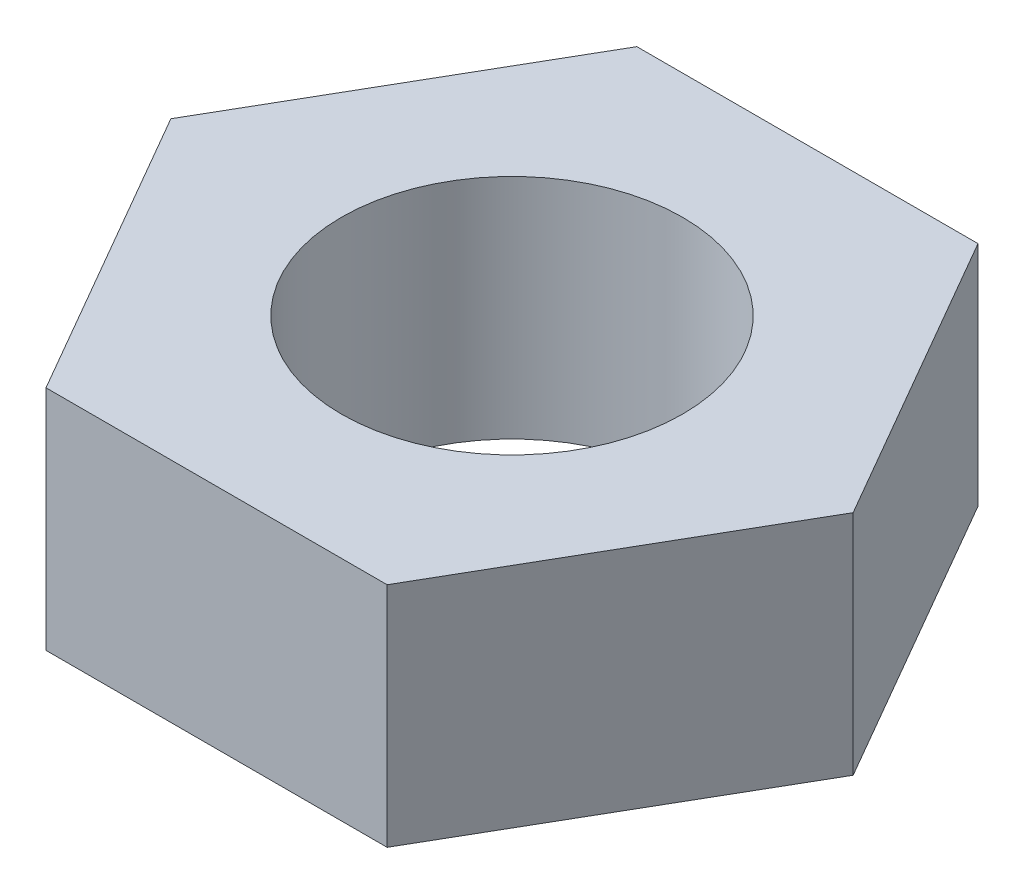
ISO-10303-21;
HEADER;
FILE_DESCRIPTION(('STEP AP214'),'2;1');
FILE_NAME('part.step','',(''),(''),'','','');
FILE_SCHEMA(('AUTOMOTIVE_DESIGN { 1 0 10303 214 1 1 1 1 }'));
ENDSEC;
DATA;
#1=APPLICATION_CONTEXT('core data for automotive mechanical design processes');
#2=APPLICATION_PROTOCOL_DEFINITION('international standard','automotive_design',2000,#1);
#3=PRODUCT_CONTEXT('',#1,'mechanical');
#4=PRODUCT('Part','Part','',(#3));
#5=PRODUCT_RELATED_PRODUCT_CATEGORY('part','',(#4));
#6=PRODUCT_DEFINITION_FORMATION('','',#4);
#7=PRODUCT_DEFINITION_CONTEXT('part definition',#1,'design');
#8=PRODUCT_DEFINITION('design','',#6,#7);
#9=PRODUCT_DEFINITION_SHAPE('','',#8);
#10=(LENGTH_UNIT() NAMED_UNIT(*) SI_UNIT(.MILLI.,.METRE.));
#11=(NAMED_UNIT(*) PLANE_ANGLE_UNIT() SI_UNIT($,.RADIAN.));
#12=(NAMED_UNIT(*) SI_UNIT($,.STERADIAN.) SOLID_ANGLE_UNIT());
#13=UNCERTAINTY_MEASURE_WITH_UNIT(LENGTH_MEASURE(1.E-05),#10,'distance_accuracy_value','');
#14=(GEOMETRIC_REPRESENTATION_CONTEXT(3) GLOBAL_UNCERTAINTY_ASSIGNED_CONTEXT((#13)) GLOBAL_UNIT_ASSIGNED_CONTEXT((#10,
#11,#12)) REPRESENTATION_CONTEXT('',''));
#15=CARTESIAN_POINT('',(0.,0.,0.));
#16=DIRECTION('',(0.,0.,1.));
#17=DIRECTION('',(1.,0.,0.));
#18=AXIS2_PLACEMENT_3D('',#15,#16,#17);
#19=CARTESIAN_POINT('',(0.,2.,0.));
#20=DIRECTION('',(0.,1.,0.));
#21=DIRECTION('',(0.,0.,1.));
#22=AXIS2_PLACEMENT_3D('',#19,#20,#21);
#23=PLANE('',#22);
#24=DIRECTION('',(0.5,0.,-0.866025403784439));
#25=VECTOR('',#24,1.);
#26=CARTESIAN_POINT('',(1.50000000000001,2.,2.59807621135334));
#27=LINE('',#26,#25);
#28=CARTESIAN_POINT('',(1.50000000000001,2.,2.59807621135334));
#29=VERTEX_POINT('',#28);
#30=CARTESIAN_POINT('',(3.00000000000002,2.,0.));
#31=VERTEX_POINT('',#30);
#32=EDGE_CURVE('E135',#29,#31,#27,.T.);
#33=ORIENTED_EDGE('',*,*,#32,.T.);
#34=DIRECTION('',(-0.5,0.,-0.866025403784439));
#35=VECTOR('',#34,1.);
#36=CARTESIAN_POINT('',(3.00000000000002,2.,0.));
#37=LINE('',#36,#35);
#38=CARTESIAN_POINT('',(1.50000000000001,2.,-2.59807621135334));
#39=VERTEX_POINT('',#38);
#40=EDGE_CURVE('E93',#31,#39,#37,.T.);
#41=ORIENTED_EDGE('',*,*,#40,.T.);
#42=DIRECTION('',(-1.,0.,0.));
#43=VECTOR('',#42,1.);
#44=CARTESIAN_POINT('',(1.50000000000001,2.,-2.59807621135334));
#45=LINE('',#44,#43);
#46=CARTESIAN_POINT('',(-1.50000000000001,2.,-2.59807621135334));
#47=VERTEX_POINT('',#46);
#48=EDGE_CURVE('E106',#39,#47,#45,.T.);
#49=ORIENTED_EDGE('',*,*,#48,.T.);
#50=DIRECTION('',(-0.5,0.,0.866025403784439));
#51=VECTOR('',#50,1.);
#52=CARTESIAN_POINT('',(-1.50000000000001,2.,-2.59807621135334));
#53=LINE('',#52,#51);
#54=CARTESIAN_POINT('',(-3.00000000000002,2.,0.));
#55=VERTEX_POINT('',#54);
#56=EDGE_CURVE('E100',#47,#55,#53,.T.);
#57=ORIENTED_EDGE('',*,*,#56,.T.);
#58=DIRECTION('',(0.5,0.,0.866025403784439));
#59=VECTOR('',#58,1.);
#60=CARTESIAN_POINT('',(-3.00000000000002,2.,0.));
#61=LINE('',#60,#59);
#62=CARTESIAN_POINT('',(-1.50000000000001,2.,2.59807621135334));
#63=VERTEX_POINT('',#62);
#64=EDGE_CURVE('E104',#55,#63,#61,.T.);
#65=ORIENTED_EDGE('',*,*,#64,.T.);
#66=DIRECTION('',(1.,0.,0.));
#67=VECTOR('',#66,1.);
#68=CARTESIAN_POINT('',(-1.50000000000001,2.,2.59807621135334));
#69=LINE('',#68,#67);
#70=EDGE_CURVE('E56',#63,#29,#69,.T.);
#71=ORIENTED_EDGE('',*,*,#70,.T.);
#72=EDGE_LOOP('',(#33,#41,#49,#57,#65,#71));
#73=FACE_BOUND('',#72,.T.);
#74=CARTESIAN_POINT('',(0.,2.,0.));
#75=DIRECTION('',(0.,1.,0.));
#76=DIRECTION('',(0.,0.,1.));
#77=AXIS2_PLACEMENT_3D('',#74,#75,#76);
#78=CIRCLE('',#77,1.5);
#79=CARTESIAN_POINT('',(0.,2.,1.5));
#80=VERTEX_POINT('',#79);
#81=EDGE_CURVE('E128',#80,#80,#78,.T.);
#82=ORIENTED_EDGE('',*,*,#81,.F.);
#83=EDGE_LOOP('',(#82));
#84=FACE_BOUND('',#83,.T.);
#85=ADVANCED_FACE('F39',(#73,#84),#23,.T.);
#86=CARTESIAN_POINT('',(0.,0.,0.));
#87=DIRECTION('',(0.,1.,0.));
#88=DIRECTION('',(0.,0.,1.));
#89=AXIS2_PLACEMENT_3D('',#86,#87,#88);
#90=PLANE('',#89);
#91=DIRECTION('',(0.5,0.,-0.866025403784439));
#92=VECTOR('',#91,1.);
#93=CARTESIAN_POINT('',(1.50000000000001,0.,2.59807621135334));
#94=LINE('',#93,#92);
#95=CARTESIAN_POINT('',(1.50000000000001,0.,2.59807621135334));
#96=VERTEX_POINT('',#95);
#97=CARTESIAN_POINT('',(3.00000000000002,0.,0.));
#98=VERTEX_POINT('',#97);
#99=EDGE_CURVE('E124',#96,#98,#94,.T.);
#100=ORIENTED_EDGE('',*,*,#99,.F.);
#101=DIRECTION('',(1.,0.,0.));
#102=VECTOR('',#101,1.);
#103=CARTESIAN_POINT('',(-1.50000000000001,0.,2.59807621135334));
#104=LINE('',#103,#102);
#105=CARTESIAN_POINT('',(-1.50000000000001,0.,2.59807621135334));
#106=VERTEX_POINT('',#105);
#107=EDGE_CURVE('E85',#106,#96,#104,.T.);
#108=ORIENTED_EDGE('',*,*,#107,.F.);
#109=DIRECTION('',(0.5,0.,0.866025403784439));
#110=VECTOR('',#109,1.);
#111=CARTESIAN_POINT('',(-3.00000000000002,0.,0.));
#112=LINE('',#111,#110);
#113=CARTESIAN_POINT('',(-3.00000000000002,0.,0.));
#114=VERTEX_POINT('',#113);
#115=EDGE_CURVE('E79',#114,#106,#112,.T.);
#116=ORIENTED_EDGE('',*,*,#115,.F.);
#117=DIRECTION('',(-0.5,0.,0.866025403784439));
#118=VECTOR('',#117,1.);
#119=CARTESIAN_POINT('',(-1.50000000000001,0.,-2.59807621135334));
#120=LINE('',#119,#118);
#121=CARTESIAN_POINT('',(-1.50000000000001,0.,-2.59807621135334));
#122=VERTEX_POINT('',#121);
#123=EDGE_CURVE('E114',#122,#114,#120,.T.);
#124=ORIENTED_EDGE('',*,*,#123,.F.);
#125=DIRECTION('',(-1.,0.,0.));
#126=VECTOR('',#125,1.);
#127=CARTESIAN_POINT('',(1.50000000000001,0.,-2.59807621135334));
#128=LINE('',#127,#126);
#129=CARTESIAN_POINT('',(1.50000000000001,0.,-2.59807621135334));
#130=VERTEX_POINT('',#129);
#131=EDGE_CURVE('E130',#130,#122,#128,.T.);
#132=ORIENTED_EDGE('',*,*,#131,.F.);
#133=DIRECTION('',(-0.5,0.,-0.866025403784439));
#134=VECTOR('',#133,1.);
#135=CARTESIAN_POINT('',(3.00000000000002,0.,0.));
#136=LINE('',#135,#134);
#137=EDGE_CURVE('E127',#98,#130,#136,.T.);
#138=ORIENTED_EDGE('',*,*,#137,.F.);
#139=EDGE_LOOP('',(#100,#108,#116,#124,#132,#138));
#140=FACE_BOUND('',#139,.T.);
#141=CARTESIAN_POINT('',(0.,0.,0.));
#142=DIRECTION('',(0.,1.,0.));
#143=DIRECTION('',(0.,0.,1.));
#144=AXIS2_PLACEMENT_3D('',#141,#142,#143);
#145=CIRCLE('',#144,1.5);
#146=CARTESIAN_POINT('',(0.,0.,1.5));
#147=VERTEX_POINT('',#146);
#148=EDGE_CURVE('E228',#147,#147,#145,.T.);
#149=ORIENTED_EDGE('',*,*,#148,.T.);
#150=EDGE_LOOP('',(#149));
#151=FACE_BOUND('',#150,.T.);
#152=ADVANCED_FACE('F144',(#140,#151),#90,.F.);
#153=CARTESIAN_POINT('',(1.50000000000001,2.,2.59807621135334));
#154=DIRECTION('',(-0.866025403784439,0.,-0.5));
#155=DIRECTION('',(-0.5,0.,0.866025403784439));
#156=AXIS2_PLACEMENT_3D('',#153,#154,#155);
#157=PLANE('',#156);
#158=ORIENTED_EDGE('',*,*,#99,.T.);
#159=DIRECTION('',(0.,-1.,0.));
#160=VECTOR('',#159,1.);
#161=CARTESIAN_POINT('',(3.00000000000002,2.,0.));
#162=LINE('',#161,#160);
#163=EDGE_CURVE('E11',#31,#98,#162,.T.);
#164=ORIENTED_EDGE('',*,*,#163,.F.);
#165=ORIENTED_EDGE('',*,*,#32,.F.);
#166=DIRECTION('',(0.,-1.,0.));
#167=VECTOR('',#166,1.);
#168=CARTESIAN_POINT('',(1.50000000000001,2.,2.59807621135334));
#169=LINE('',#168,#167);
#170=EDGE_CURVE('E120',#29,#96,#169,.T.);
#171=ORIENTED_EDGE('',*,*,#170,.T.);
#172=EDGE_LOOP('',(#158,#164,#165,#171));
#173=FACE_BOUND('',#172,.T.);
#174=ADVANCED_FACE('F41',(#173),#157,.F.);
#175=CARTESIAN_POINT('',(3.00000000000002,2.,0.));
#176=DIRECTION('',(-0.866025403784439,0.,0.5));
#177=DIRECTION('',(0.5,0.,0.866025403784439));
#178=AXIS2_PLACEMENT_3D('',#175,#176,#177);
#179=PLANE('',#178);
#180=ORIENTED_EDGE('',*,*,#137,.T.);
#181=DIRECTION('',(0.,-1.,0.));
#182=VECTOR('',#181,1.);
#183=CARTESIAN_POINT('',(1.50000000000001,2.,-2.59807621135334));
#184=LINE('',#183,#182);
#185=EDGE_CURVE('E48',#39,#130,#184,.T.);
#186=ORIENTED_EDGE('',*,*,#185,.F.);
#187=ORIENTED_EDGE('',*,*,#40,.F.);
#188=ORIENTED_EDGE('',*,*,#163,.T.);
#189=EDGE_LOOP('',(#180,#186,#187,#188));
#190=FACE_BOUND('',#189,.T.);
#191=ADVANCED_FACE('F169',(#190),#179,.F.);
#192=CARTESIAN_POINT('',(1.50000000000001,2.,-2.59807621135334));
#193=DIRECTION('',(0.,0.,1.));
#194=DIRECTION('',(1.,0.,0.));
#195=AXIS2_PLACEMENT_3D('',#192,#193,#194);
#196=PLANE('',#195);
#197=ORIENTED_EDGE('',*,*,#131,.T.);
#198=DIRECTION('',(0.,-1.,0.));
#199=VECTOR('',#198,1.);
#200=CARTESIAN_POINT('',(-1.50000000000001,2.,-2.59807621135334));
#201=LINE('',#200,#199);
#202=EDGE_CURVE('E115',#47,#122,#201,.T.);
#203=ORIENTED_EDGE('',*,*,#202,.F.);
#204=ORIENTED_EDGE('',*,*,#48,.F.);
#205=ORIENTED_EDGE('',*,*,#185,.T.);
#206=EDGE_LOOP('',(#197,#203,#204,#205));
#207=FACE_BOUND('',#206,.T.);
#208=ADVANCED_FACE('F141',(#207),#196,.F.);
#209=CARTESIAN_POINT('',(-1.50000000000001,2.,-2.59807621135334));
#210=DIRECTION('',(0.866025403784439,0.,0.5));
#211=DIRECTION('',(0.5,0.,-0.866025403784439));
#212=AXIS2_PLACEMENT_3D('',#209,#210,#211);
#213=PLANE('',#212);
#214=ORIENTED_EDGE('',*,*,#123,.T.);
#215=DIRECTION('',(0.,-1.,0.));
#216=VECTOR('',#215,1.);
#217=CARTESIAN_POINT('',(-3.00000000000002,2.,0.));
#218=LINE('',#217,#216);
#219=EDGE_CURVE('E111',#55,#114,#218,.T.);
#220=ORIENTED_EDGE('',*,*,#219,.F.);
#221=ORIENTED_EDGE('',*,*,#56,.F.);
#222=ORIENTED_EDGE('',*,*,#202,.T.);
#223=EDGE_LOOP('',(#214,#220,#221,#222));
#224=FACE_BOUND('',#223,.T.);
#225=ADVANCED_FACE('F112',(#224),#213,.F.);
#226=CARTESIAN_POINT('',(-3.00000000000002,2.,0.));
#227=DIRECTION('',(0.866025403784439,0.,-0.5));
#228=DIRECTION('',(-0.5,0.,-0.866025403784439));
#229=AXIS2_PLACEMENT_3D('',#226,#227,#228);
#230=PLANE('',#229);
#231=ORIENTED_EDGE('',*,*,#115,.T.);
#232=DIRECTION('',(0.,-1.,0.));
#233=VECTOR('',#232,1.);
#234=CARTESIAN_POINT('',(-1.50000000000001,2.,2.59807621135334));
#235=LINE('',#234,#233);
#236=EDGE_CURVE('E116',#63,#106,#235,.T.);
#237=ORIENTED_EDGE('',*,*,#236,.F.);
#238=ORIENTED_EDGE('',*,*,#64,.F.);
#239=ORIENTED_EDGE('',*,*,#219,.T.);
#240=EDGE_LOOP('',(#231,#237,#238,#239));
#241=FACE_BOUND('',#240,.T.);
#242=ADVANCED_FACE('F118',(#241),#230,.F.);
#243=CARTESIAN_POINT('',(-1.50000000000001,2.,2.59807621135334));
#244=DIRECTION('',(0.,0.,-1.));
#245=DIRECTION('',(-1.,0.,0.));
#246=AXIS2_PLACEMENT_3D('',#243,#244,#245);
#247=PLANE('',#246);
#248=ORIENTED_EDGE('',*,*,#107,.T.);
#249=ORIENTED_EDGE('',*,*,#170,.F.);
#250=ORIENTED_EDGE('',*,*,#70,.F.);
#251=ORIENTED_EDGE('',*,*,#236,.T.);
#252=EDGE_LOOP('',(#248,#249,#250,#251));
#253=FACE_BOUND('',#252,.T.);
#254=ADVANCED_FACE('F149',(#253),#247,.F.);
#255=CARTESIAN_POINT('',(0.,2.,0.));
#256=DIRECTION('',(0.,-1.,0.));
#257=DIRECTION('',(0.,0.,-1.));
#258=AXIS2_PLACEMENT_3D('',#255,#256,#257);
#259=CYLINDRICAL_SURFACE('',#258,1.5);
#260=ORIENTED_EDGE('',*,*,#81,.T.);
#261=EDGE_LOOP('',(#260));
#262=FACE_BOUND('',#261,.T.);
#263=ORIENTED_EDGE('',*,*,#148,.F.);
#264=EDGE_LOOP('',(#263));
#265=FACE_BOUND('',#264,.T.);
#266=ADVANCED_FACE('F151',(#262,#265),#259,.F.);
#267=CLOSED_SHELL('',(#85,#152,#174,#191,#208,#225,#242,#254,#266));
#268=MANIFOLD_SOLID_BREP('B2',#267);
#269=ADVANCED_BREP_SHAPE_REPRESENTATION('',(#18,#268),#14);
#270=SHAPE_DEFINITION_REPRESENTATION(#9,#269);
ENDSEC;
END-ISO-10303-21;
